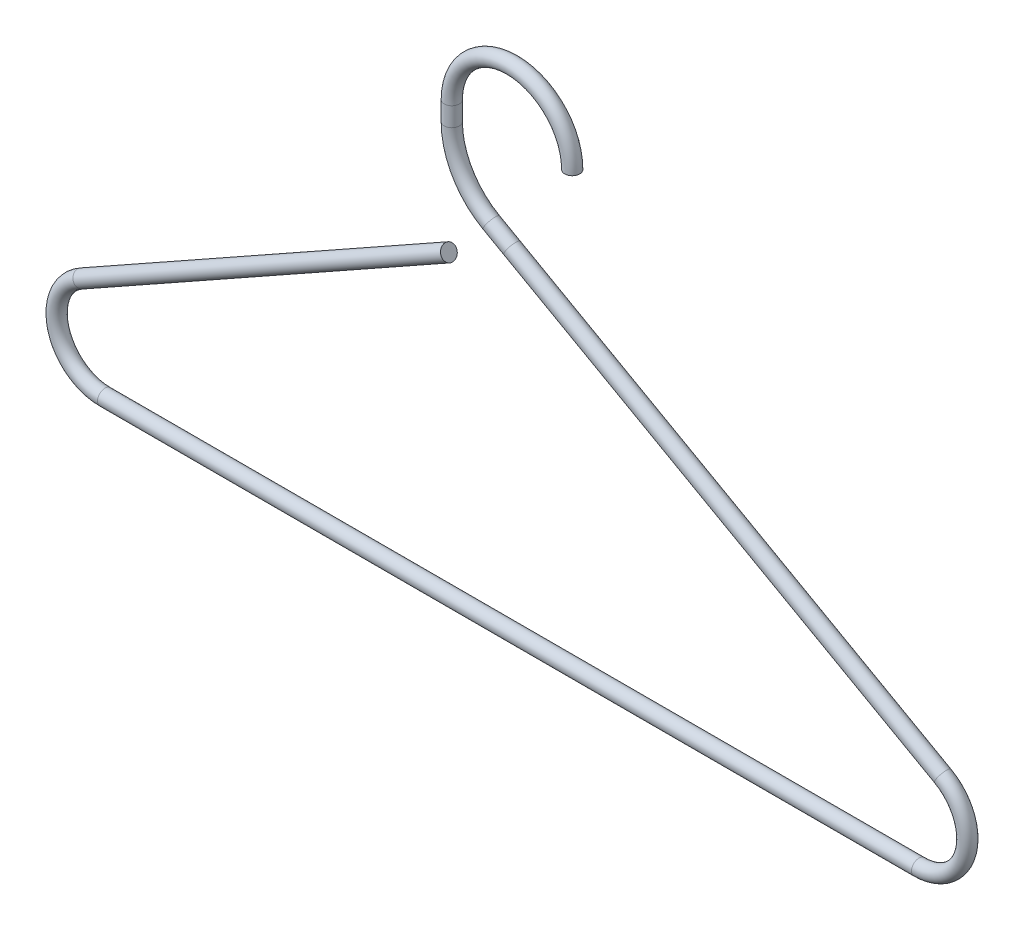
ISO-10303-21;
HEADER;
FILE_DESCRIPTION(('STEP AP214'),'2;1');
FILE_NAME('part.step','',(''),(''),'','','');
FILE_SCHEMA(('AUTOMOTIVE_DESIGN { 1 0 10303 214 1 1 1 1 }'));
ENDSEC;
DATA;
#1=APPLICATION_CONTEXT('core data for automotive mechanical design processes');
#2=APPLICATION_PROTOCOL_DEFINITION('international standard','automotive_design',2000,#1);
#3=PRODUCT_CONTEXT('',#1,'mechanical');
#4=PRODUCT('Part','Part','',(#3));
#5=PRODUCT_RELATED_PRODUCT_CATEGORY('part','',(#4));
#6=PRODUCT_DEFINITION_FORMATION('','',#4);
#7=PRODUCT_DEFINITION_CONTEXT('part definition',#1,'design');
#8=PRODUCT_DEFINITION('design','',#6,#7);
#9=PRODUCT_DEFINITION_SHAPE('','',#8);
#10=(LENGTH_UNIT() NAMED_UNIT(*) SI_UNIT(.MILLI.,.METRE.));
#11=(NAMED_UNIT(*) PLANE_ANGLE_UNIT() SI_UNIT($,.RADIAN.));
#12=(NAMED_UNIT(*) SI_UNIT($,.STERADIAN.) SOLID_ANGLE_UNIT());
#13=UNCERTAINTY_MEASURE_WITH_UNIT(LENGTH_MEASURE(1.E-05),#10,'distance_accuracy_value','');
#14=(GEOMETRIC_REPRESENTATION_CONTEXT(3) GLOBAL_UNCERTAINTY_ASSIGNED_CONTEXT((#13)) GLOBAL_UNIT_ASSIGNED_CONTEXT((#10,
#11,#12)) REPRESENTATION_CONTEXT('',''));
#15=CARTESIAN_POINT('',(0.,0.,0.));
#16=DIRECTION('',(0.,0.,1.));
#17=DIRECTION('',(1.,0.,0.));
#18=AXIS2_PLACEMENT_3D('',#15,#16,#17);
#19=CARTESIAN_POINT('',(19.9996352314866,95.0075967750595,0.));
#20=DIRECTION('',(-0.00603957934694345,-0.999981761574336,0.));
#21=DIRECTION('',(0.,0.,-1.));
#22=AXIS2_PLACEMENT_3D('',#19,#20,#21);
#23=PLANE('',#22);
#24=CARTESIAN_POINT('',(19.9996352314866,95.0075967750595,0.));
#25=DIRECTION('',(-0.00603957934694345,-0.999981761574336,0.));
#26=DIRECTION('',(0.,0.,-1.));
#27=AXIS2_PLACEMENT_3D('',#24,#25,#26);
#28=CIRCLE('',#27,2.5);
#29=CARTESIAN_POINT('',(22.4995896354224,94.9924978266922,0.));
#30=VERTEX_POINT('',#29);
#31=EDGE_CURVE('E65',#30,#30,#28,.T.);
#32=ORIENTED_EDGE('',*,*,#31,.T.);
#33=EDGE_LOOP('',(#32));
#34=FACE_BOUND('',#33,.T.);
#35=ADVANCED_FACE('F31',(#34),#23,.T.);
#36=CARTESIAN_POINT('',(-20.9631013197422,50.7200986416511,0.));
#37=DIRECTION('',(-0.871889231627964,-0.489703142496757,0.));
#38=DIRECTION('',(0.,0.,-1.));
#39=AXIS2_PLACEMENT_3D('',#36,#37,#38);
#40=PLANE('',#39);
#41=CARTESIAN_POINT('',(-20.9631013197422,50.7200986416511,0.));
#42=DIRECTION('',(-0.871889231627964,-0.489703142496757,0.));
#43=DIRECTION('',(0.,0.,-1.));
#44=AXIS2_PLACEMENT_3D('',#41,#42,#43);
#45=CIRCLE('',#44,2.5);
#46=CARTESIAN_POINT('',(-20.9631013197422,50.7200986416511,-2.5));
#47=VERTEX_POINT('',#46);
#48=EDGE_CURVE('E10',#47,#47,#45,.T.);
#49=ORIENTED_EDGE('',*,*,#48,.F.);
#50=EDGE_LOOP('',(#49));
#51=FACE_BOUND('',#50,.T.);
#52=ADVANCED_FACE('F73',(#51),#40,.F.);
#53=CARTESIAN_POINT('',(0.,95.1283883619984,0.));
#54=DIRECTION('',(0.,0.,1.));
#55=DIRECTION('',(1.,0.,0.));
#56=AXIS2_PLACEMENT_3D('',#53,#54,#55);
#57=TOROIDAL_SURFACE('',#56,19.9999999999999,2.5);
#58=CARTESIAN_POINT('',(-19.9999999999999,95.1283883619984,0.));
#59=DIRECTION('',(0.,1.,0.));
#60=DIRECTION('',(0.,0.,-1.));
#61=AXIS2_PLACEMENT_3D('',#58,#59,#60);
#62=CIRCLE('',#61,2.5);
#63=CARTESIAN_POINT('',(-22.4999999999999,95.1283883619984,0.));
#64=VERTEX_POINT('',#63);
#65=EDGE_CURVE('E62',#64,#64,#62,.T.);
#66=CARTESIAN_POINT('',(0.,95.1283883619984,0.));
#67=DIRECTION('',(0.,0.,1.));
#68=DIRECTION('',(1.,0.,0.));
#69=AXIS2_PLACEMENT_3D('',#66,#67,#68);
#70=CIRCLE('',#69,22.4999999999999);
#71=EDGE_CURVE('',#30,#64,#70,.T.);
#72=ORIENTED_EDGE('',*,*,#31,.F.);
#73=ORIENTED_EDGE('',*,*,#65,.T.);
#74=ORIENTED_EDGE('',*,*,#71,.T.);
#75=ORIENTED_EDGE('',*,*,#71,.F.);
#76=EDGE_LOOP('',(#72,#74,#73,#75));
#77=FACE_BOUND('',#76,.T.);
#78=ADVANCED_FACE('F70',(#77),#57,.T.);
#79=CARTESIAN_POINT('',(-19.9999999999999,95.1283883619984,0.));
#80=DIRECTION('',(0.,-1.,0.));
#81=DIRECTION('',(1.,0.,0.));
#82=AXIS2_PLACEMENT_3D('',#79,#80,#81);
#83=CYLINDRICAL_SURFACE('',#82,2.5);
#84=CARTESIAN_POINT('',(-19.9999999999998,88.8070400766294,0.));
#85=DIRECTION('',(0.,1.,0.));
#86=DIRECTION('',(0.,0.,-1.));
#87=AXIS2_PLACEMENT_3D('',#84,#85,#86);
#88=CIRCLE('',#87,2.5);
#89=CARTESIAN_POINT('',(-22.4999999999999,88.8070400766294,0.));
#90=VERTEX_POINT('',#89);
#91=EDGE_CURVE('E59',#90,#90,#88,.T.);
#92=ORIENTED_EDGE('',*,*,#91,.T.);
#93=EDGE_LOOP('',(#92));
#94=FACE_BOUND('',#93,.T.);
#95=ORIENTED_EDGE('',*,*,#65,.F.);
#96=EDGE_LOOP('',(#95));
#97=FACE_BOUND('',#96,.T.);
#98=ADVANCED_FACE('F72',(#94,#97),#83,.T.);
#99=CARTESIAN_POINT('',(5.76507079514625,88.8070400766296,0.));
#100=DIRECTION('',(0.,0.,1.));
#101=DIRECTION('',(1.,0.,0.));
#102=AXIS2_PLACEMENT_3D('',#99,#100,#101);
#103=TOROIDAL_SURFACE('',#102,25.7650707951462,2.5);
#104=CARTESIAN_POINT('',(-6.85216533988821,66.3427522982095,0.));
#105=DIRECTION('',(-0.871889231627964,0.489703142496756,0.));
#106=DIRECTION('',(0.,0.,-1.));
#107=AXIS2_PLACEMENT_3D('',#104,#105,#106);
#108=CIRCLE('',#107,2.5);
#109=CARTESIAN_POINT('',(-8.0764231961301,64.1630292191396,0.));
#110=VERTEX_POINT('',#109);
#111=EDGE_CURVE('E56',#110,#110,#108,.T.);
#112=CARTESIAN_POINT('',(5.76507079514625,88.8070400766296,0.));
#113=DIRECTION('',(0.,0.,1.));
#114=DIRECTION('',(1.,0.,0.));
#115=AXIS2_PLACEMENT_3D('',#112,#113,#114);
#116=CIRCLE('',#115,28.2650707951462);
#117=EDGE_CURVE('',#90,#110,#116,.T.);
#118=ORIENTED_EDGE('',*,*,#91,.F.);
#119=ORIENTED_EDGE('',*,*,#111,.T.);
#120=ORIENTED_EDGE('',*,*,#117,.T.);
#121=ORIENTED_EDGE('',*,*,#117,.F.);
#122=EDGE_LOOP('',(#118,#120,#119,#121));
#123=FACE_BOUND('',#122,.T.);
#124=ADVANCED_FACE('F80',(#123),#103,.T.);
#125=CARTESIAN_POINT('',(-6.85216533988825,66.3427522982094,0.));
#126=DIRECTION('',(0.871889231627962,-0.48970314249676,0.));
#127=DIRECTION('',(0.48970314249676,0.871889231627962,0.));
#128=AXIS2_PLACEMENT_3D('',#125,#126,#127);
#129=CYLINDRICAL_SURFACE('',#128,2.5);
#130=CARTESIAN_POINT('',(0.,62.494182115062,0.));
#131=DIRECTION('',(-0.871889231627962,0.48970314249676,0.));
#132=DIRECTION('',(0.,0.,-1.));
#133=AXIS2_PLACEMENT_3D('',#130,#131,#132);
#134=CIRCLE('',#133,2.5);
#135=CARTESIAN_POINT('',(0.,62.494182115062,-2.5));
#136=VERTEX_POINT('',#135);
#137=EDGE_CURVE('E53',#136,#136,#134,.T.);
#138=ORIENTED_EDGE('',*,*,#137,.T.);
#139=EDGE_LOOP('',(#138));
#140=FACE_BOUND('',#139,.T.);
#141=ORIENTED_EDGE('',*,*,#111,.F.);
#142=EDGE_LOOP('',(#141));
#143=FACE_BOUND('',#142,.T.);
#144=ADVANCED_FACE('F105',(#140,#143),#129,.T.);
#145=CARTESIAN_POINT('',(0.,62.494182115062,0.));
#146=DIRECTION('',(0.871889231627964,-0.489703142496757,0.));
#147=DIRECTION('',(0.489703142496757,0.871889231627964,0.));
#148=AXIS2_PLACEMENT_3D('',#145,#146,#147);
#149=CYLINDRICAL_SURFACE('',#148,2.5);
#150=CARTESIAN_POINT('',(143.073579672423,-17.8641696482983,0.));
#151=DIRECTION('',(-0.871889231627964,0.489703142496758,0.));
#152=DIRECTION('',(0.,0.,-1.));
#153=AXIS2_PLACEMENT_3D('',#150,#151,#152);
#154=CIRCLE('',#153,2.5);
#155=CARTESIAN_POINT('',(144.297837528665,-15.6844465692286,0.));
#156=VERTEX_POINT('',#155);
#157=EDGE_CURVE('E50',#156,#156,#154,.T.);
#158=ORIENTED_EDGE('',*,*,#157,.T.);
#159=EDGE_LOOP('',(#158));
#160=FACE_BOUND('',#159,.T.);
#161=ORIENTED_EDGE('',*,*,#137,.F.);
#162=EDGE_LOOP('',(#161));
#163=FACE_BOUND('',#162,.T.);
#164=ADVANCED_FACE('F101',(#160,#163),#149,.T.);
#165=CARTESIAN_POINT('',(135.202616282694,-31.8779825616761,0.));
#166=DIRECTION('',(0.,0.,-1.));
#167=DIRECTION('',(-1.,0.,0.));
#168=AXIS2_PLACEMENT_3D('',#165,#166,#167);
#169=TOROIDAL_SURFACE('',#168,16.0729280796501,2.5);
#170=CARTESIAN_POINT('',(135.202616282694,-47.9509106413262,0.));
#171=DIRECTION('',(1.,0.,0.));
#172=DIRECTION('',(0.,0.,-1.));
#173=AXIS2_PLACEMENT_3D('',#170,#171,#172);
#174=CIRCLE('',#173,2.5);
#175=CARTESIAN_POINT('',(135.202616282694,-50.4509106413262,0.));
#176=VERTEX_POINT('',#175);
#177=EDGE_CURVE('E45',#176,#176,#174,.T.);
#178=CARTESIAN_POINT('',(135.202616282694,-31.8779825616761,0.));
#179=DIRECTION('',(0.,0.,-1.));
#180=DIRECTION('',(-1.,0.,0.));
#181=AXIS2_PLACEMENT_3D('',#178,#179,#180);
#182=CIRCLE('',#181,18.5729280796501);
#183=EDGE_CURVE('',#156,#176,#182,.T.);
#184=ORIENTED_EDGE('',*,*,#157,.F.);
#185=ORIENTED_EDGE('',*,*,#177,.T.);
#186=ORIENTED_EDGE('',*,*,#183,.T.);
#187=ORIENTED_EDGE('',*,*,#183,.F.);
#188=EDGE_LOOP('',(#184,#186,#185,#187));
#189=FACE_BOUND('',#188,.T.);
#190=ADVANCED_FACE('F97',(#189),#169,.T.);
#191=CARTESIAN_POINT('',(135.202616282694,-47.9509106413259,0.));
#192=DIRECTION('',(-1.,0.,0.));
#193=DIRECTION('',(0.,-1.,0.));
#194=AXIS2_PLACEMENT_3D('',#191,#192,#193);
#195=CYLINDRICAL_SURFACE('',#194,2.5);
#196=CARTESIAN_POINT('',(-135.202616282694,-47.9509106413261,0.));
#197=DIRECTION('',(1.,0.,0.));
#198=DIRECTION('',(0.,0.,-1.));
#199=AXIS2_PLACEMENT_3D('',#196,#197,#198);
#200=CIRCLE('',#199,2.5);
#201=CARTESIAN_POINT('',(-135.202616282694,-50.4509106413262,0.));
#202=VERTEX_POINT('',#201);
#203=EDGE_CURVE('E41',#202,#202,#200,.T.);
#204=ORIENTED_EDGE('',*,*,#203,.T.);
#205=EDGE_LOOP('',(#204));
#206=FACE_BOUND('',#205,.T.);
#207=ORIENTED_EDGE('',*,*,#177,.F.);
#208=EDGE_LOOP('',(#207));
#209=FACE_BOUND('',#208,.T.);
#210=ADVANCED_FACE('F91',(#206,#209),#195,.T.);
#211=CARTESIAN_POINT('',(-135.202616282694,-31.8779825616761,0.));
#212=DIRECTION('',(0.,0.,-1.));
#213=DIRECTION('',(-1.,0.,0.));
#214=AXIS2_PLACEMENT_3D('',#211,#212,#213);
#215=TOROIDAL_SURFACE('',#214,16.0729280796501,2.5);
#216=CARTESIAN_POINT('',(-143.073579672423,-17.8641696482985,0.));
#217=DIRECTION('',(-0.871889231627963,-0.489703142496758,0.));
#218=DIRECTION('',(0.,0.,-1.));
#219=AXIS2_PLACEMENT_3D('',#216,#217,#218);
#220=CIRCLE('',#219,2.5);
#221=CARTESIAN_POINT('',(-144.297837528665,-15.6844465692286,0.));
#222=VERTEX_POINT('',#221);
#223=EDGE_CURVE('E37',#222,#222,#220,.T.);
#224=CARTESIAN_POINT('',(-135.202616282694,-31.8779825616761,0.));
#225=DIRECTION('',(0.,0.,-1.));
#226=DIRECTION('',(-1.,0.,0.));
#227=AXIS2_PLACEMENT_3D('',#224,#225,#226);
#228=CIRCLE('',#227,18.5729280796501);
#229=EDGE_CURVE('',#202,#222,#228,.T.);
#230=ORIENTED_EDGE('',*,*,#203,.F.);
#231=ORIENTED_EDGE('',*,*,#223,.T.);
#232=ORIENTED_EDGE('',*,*,#229,.T.);
#233=ORIENTED_EDGE('',*,*,#229,.F.);
#234=EDGE_LOOP('',(#230,#232,#231,#233));
#235=FACE_BOUND('',#234,.T.);
#236=ADVANCED_FACE('F86',(#235),#215,.T.);
#237=CARTESIAN_POINT('',(-143.073579672423,-17.8641696482985,0.));
#238=DIRECTION('',(0.871889231627963,0.489703142496758,0.));
#239=DIRECTION('',(-0.489703142496758,0.871889231627963,0.));
#240=AXIS2_PLACEMENT_3D('',#237,#238,#239);
#241=CYLINDRICAL_SURFACE('',#240,2.5);
#242=ORIENTED_EDGE('',*,*,#48,.T.);
#243=EDGE_LOOP('',(#242));
#244=FACE_BOUND('',#243,.T.);
#245=ORIENTED_EDGE('',*,*,#223,.F.);
#246=EDGE_LOOP('',(#245));
#247=FACE_BOUND('',#246,.T.);
#248=ADVANCED_FACE('F84',(#244,#247),#241,.T.);
#249=CLOSED_SHELL('',(#35,#52,#78,#98,#124,#144,#164,#190,#210,#236,#248));
#250=MANIFOLD_SOLID_BREP('B2',#249);
#251=ADVANCED_BREP_SHAPE_REPRESENTATION('',(#18,#250),#14);
#252=SHAPE_DEFINITION_REPRESENTATION(#9,#251);
ENDSEC;
END-ISO-10303-21;
